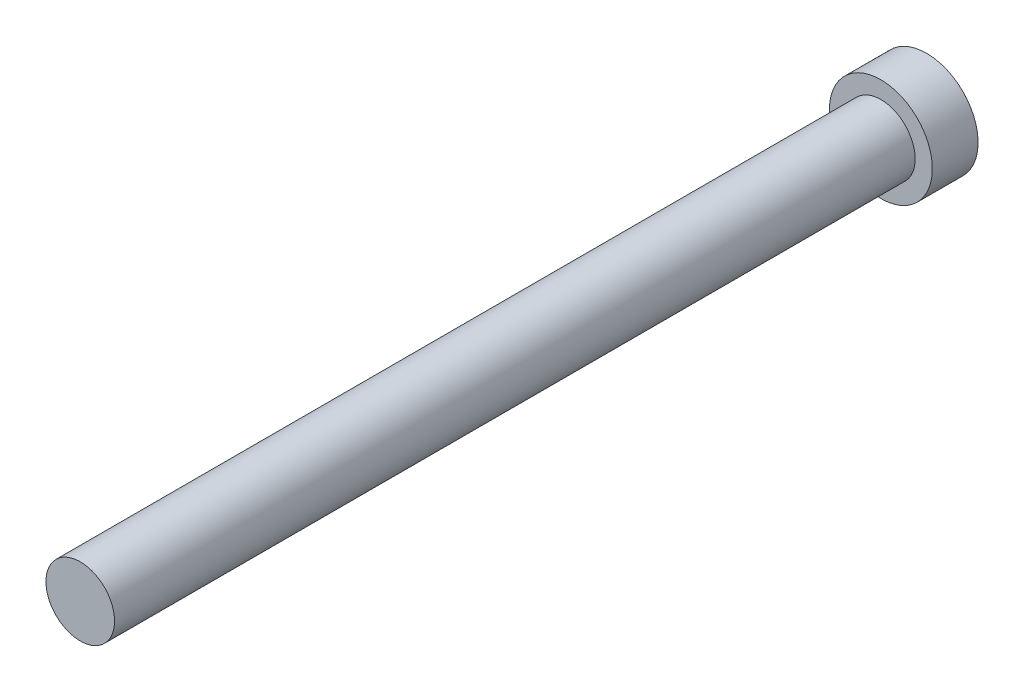
ISO-10303-21;
HEADER;
FILE_DESCRIPTION(('STEP AP214'),'2;1');
FILE_NAME('part.step','',(''),(''),'','','');
FILE_SCHEMA(('AUTOMOTIVE_DESIGN { 1 0 10303 214 1 1 1 1 }'));
ENDSEC;
DATA;
#1=APPLICATION_CONTEXT('core data for automotive mechanical design processes');
#2=APPLICATION_PROTOCOL_DEFINITION('international standard','automotive_design',2000,#1);
#3=PRODUCT_CONTEXT('',#1,'mechanical');
#4=PRODUCT('Part','Part','',(#3));
#5=PRODUCT_RELATED_PRODUCT_CATEGORY('part','',(#4));
#6=PRODUCT_DEFINITION_FORMATION('','',#4);
#7=PRODUCT_DEFINITION_CONTEXT('part definition',#1,'design');
#8=PRODUCT_DEFINITION('design','',#6,#7);
#9=PRODUCT_DEFINITION_SHAPE('','',#8);
#10=(LENGTH_UNIT() NAMED_UNIT(*) SI_UNIT(.MILLI.,.METRE.));
#11=(NAMED_UNIT(*) PLANE_ANGLE_UNIT() SI_UNIT($,.RADIAN.));
#12=(NAMED_UNIT(*) SI_UNIT($,.STERADIAN.) SOLID_ANGLE_UNIT());
#13=UNCERTAINTY_MEASURE_WITH_UNIT(LENGTH_MEASURE(1.E-05),#10,'distance_accuracy_value','');
#14=(GEOMETRIC_REPRESENTATION_CONTEXT(3) GLOBAL_UNCERTAINTY_ASSIGNED_CONTEXT((#13)) GLOBAL_UNIT_ASSIGNED_CONTEXT((#10,
#11,#12)) REPRESENTATION_CONTEXT('',''));
#15=CARTESIAN_POINT('',(0.,0.,0.));
#16=DIRECTION('',(0.,0.,1.));
#17=DIRECTION('',(1.,0.,0.));
#18=AXIS2_PLACEMENT_3D('',#15,#16,#17);
#19=CARTESIAN_POINT('',(0.,0.,35.));
#20=DIRECTION('',(0.,0.,-1.));
#21=DIRECTION('',(-1.,0.,0.));
#22=AXIS2_PLACEMENT_3D('',#19,#20,#21);
#23=CYLINDRICAL_SURFACE('',#22,1.5);
#24=CARTESIAN_POINT('',(0.,0.,35.));
#25=DIRECTION('',(0.,0.,1.));
#26=DIRECTION('',(1.,0.,0.));
#27=AXIS2_PLACEMENT_3D('',#24,#25,#26);
#28=CIRCLE('',#27,1.5);
#29=CARTESIAN_POINT('',(1.5,0.,35.));
#30=VERTEX_POINT('',#29);
#31=EDGE_CURVE('E10',#30,#30,#28,.T.);
#32=ORIENTED_EDGE('',*,*,#31,.F.);
#33=EDGE_LOOP('',(#32));
#34=FACE_BOUND('',#33,.T.);
#35=CARTESIAN_POINT('',(0.,0.,0.));
#36=DIRECTION('',(0.,0.,1.));
#37=DIRECTION('',(1.,0.,0.));
#38=AXIS2_PLACEMENT_3D('',#35,#36,#37);
#39=CIRCLE('',#38,1.5);
#40=CARTESIAN_POINT('',(1.5,0.,0.));
#41=VERTEX_POINT('',#40);
#42=EDGE_CURVE('E46',#41,#41,#39,.T.);
#43=ORIENTED_EDGE('',*,*,#42,.T.);
#44=EDGE_LOOP('',(#43));
#45=FACE_BOUND('',#44,.T.);
#46=ADVANCED_FACE('F43',(#34,#45),#23,.T.);
#47=CARTESIAN_POINT('',(0.,0.,35.));
#48=DIRECTION('',(0.,0.,1.));
#49=DIRECTION('',(1.,0.,0.));
#50=AXIS2_PLACEMENT_3D('',#47,#48,#49);
#51=PLANE('',#50);
#52=ORIENTED_EDGE('',*,*,#31,.T.);
#53=EDGE_LOOP('',(#52));
#54=FACE_BOUND('',#53,.T.);
#55=ADVANCED_FACE('F70',(#54),#51,.T.);
#56=CARTESIAN_POINT('',(0.,0.,-2.));
#57=DIRECTION('',(0.,0.,1.));
#58=DIRECTION('',(1.,0.,0.));
#59=AXIS2_PLACEMENT_3D('',#56,#57,#58);
#60=CYLINDRICAL_SURFACE('',#59,2.25);
#61=CARTESIAN_POINT('',(0.,0.,-2.));
#62=DIRECTION('',(0.,0.,-1.));
#63=DIRECTION('',(-1.,0.,0.));
#64=AXIS2_PLACEMENT_3D('',#61,#62,#63);
#65=CIRCLE('',#64,2.25);
#66=CARTESIAN_POINT('',(-2.25,0.,-2.));
#67=VERTEX_POINT('',#66);
#68=EDGE_CURVE('E55',#67,#67,#65,.T.);
#69=ORIENTED_EDGE('',*,*,#68,.F.);
#70=EDGE_LOOP('',(#69));
#71=FACE_BOUND('',#70,.T.);
#72=CARTESIAN_POINT('',(0.,0.,0.));
#73=DIRECTION('',(0.,0.,-1.));
#74=DIRECTION('',(-1.,0.,0.));
#75=AXIS2_PLACEMENT_3D('',#72,#73,#74);
#76=CIRCLE('',#75,2.25);
#77=CARTESIAN_POINT('',(-2.25,0.,0.));
#78=VERTEX_POINT('',#77);
#79=EDGE_CURVE('E57',#78,#78,#76,.T.);
#80=ORIENTED_EDGE('',*,*,#79,.T.);
#81=EDGE_LOOP('',(#80));
#82=FACE_BOUND('',#81,.T.);
#83=ADVANCED_FACE('F67',(#71,#82),#60,.T.);
#84=CARTESIAN_POINT('',(0.,0.,-2.));
#85=DIRECTION('',(0.,0.,-1.));
#86=DIRECTION('',(-1.,0.,0.));
#87=AXIS2_PLACEMENT_3D('',#84,#85,#86);
#88=PLANE('',#87);
#89=ORIENTED_EDGE('',*,*,#68,.T.);
#90=EDGE_LOOP('',(#89));
#91=FACE_BOUND('',#90,.T.);
#92=ADVANCED_FACE('F65',(#91),#88,.T.);
#93=CARTESIAN_POINT('',(0.,0.,0.));
#94=DIRECTION('',(0.,0.,-1.));
#95=DIRECTION('',(-1.,0.,0.));
#96=AXIS2_PLACEMENT_3D('',#93,#94,#95);
#97=PLANE('',#96);
#98=ORIENTED_EDGE('',*,*,#42,.F.);
#99=EDGE_LOOP('',(#98));
#100=FACE_BOUND('',#99,.T.);
#101=ORIENTED_EDGE('',*,*,#79,.F.);
#102=EDGE_LOOP('',(#101));
#103=FACE_BOUND('',#102,.T.);
#104=ADVANCED_FACE('F74',(#100,#103),#97,.F.);
#105=CLOSED_SHELL('',(#46,#55,#83,#92,#104));
#106=MANIFOLD_SOLID_BREP('B2',#105);
#107=ADVANCED_BREP_SHAPE_REPRESENTATION('',(#18,#106),#14);
#108=SHAPE_DEFINITION_REPRESENTATION(#9,#107);
ENDSEC;
END-ISO-10303-21;
